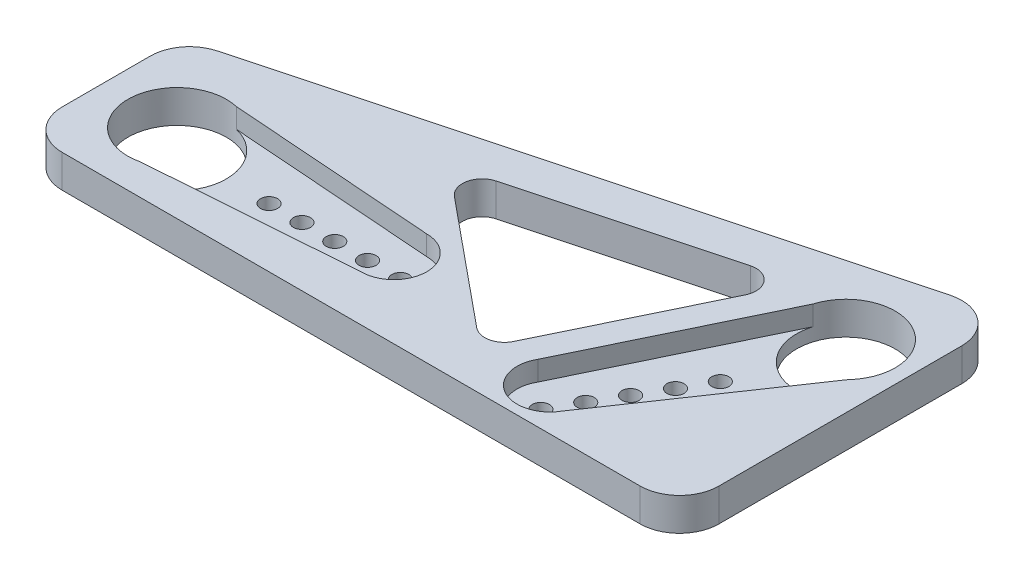
ISO-10303-21;
HEADER;
FILE_DESCRIPTION(('STEP AP214'),'2;1');
FILE_NAME('part.step','',(''),(''),'','','');
FILE_SCHEMA(('AUTOMOTIVE_DESIGN { 1 0 10303 214 1 1 1 1 }'));
ENDSEC;
DATA;
#1=APPLICATION_CONTEXT('core data for automotive mechanical design processes');
#2=APPLICATION_PROTOCOL_DEFINITION('international standard','automotive_design',2000,#1);
#3=PRODUCT_CONTEXT('',#1,'mechanical');
#4=PRODUCT('Part','Part','',(#3));
#5=PRODUCT_RELATED_PRODUCT_CATEGORY('part','',(#4));
#6=PRODUCT_DEFINITION_FORMATION('','',#4);
#7=PRODUCT_DEFINITION_CONTEXT('part definition',#1,'design');
#8=PRODUCT_DEFINITION('design','',#6,#7);
#9=PRODUCT_DEFINITION_SHAPE('','',#8);
#10=(LENGTH_UNIT() NAMED_UNIT(*) SI_UNIT(.MILLI.,.METRE.));
#11=(NAMED_UNIT(*) PLANE_ANGLE_UNIT() SI_UNIT($,.RADIAN.));
#12=(NAMED_UNIT(*) SI_UNIT($,.STERADIAN.) SOLID_ANGLE_UNIT());
#13=UNCERTAINTY_MEASURE_WITH_UNIT(LENGTH_MEASURE(1.E-05),#10,'distance_accuracy_value','');
#14=(GEOMETRIC_REPRESENTATION_CONTEXT(3) GLOBAL_UNCERTAINTY_ASSIGNED_CONTEXT((#13)) GLOBAL_UNIT_ASSIGNED_CONTEXT((#10,
#11,#12)) REPRESENTATION_CONTEXT('',''));
#15=CARTESIAN_POINT('',(0.,0.,0.));
#16=DIRECTION('',(0.,0.,1.));
#17=DIRECTION('',(1.,0.,0.));
#18=AXIS2_PLACEMENT_3D('',#15,#16,#17);
#19=CARTESIAN_POINT('',(37.916201182934,2.5,-4.94263164512558));
#20=DIRECTION('',(0.,-1.,0.));
#21=DIRECTION('',(0.,0.,-1.));
#22=AXIS2_PLACEMENT_3D('',#19,#20,#21);
#23=CYLINDRICAL_SURFACE('',#22,0.649999999999983);
#24=CARTESIAN_POINT('',(37.916201182934,0.,-4.94263164512558));
#25=DIRECTION('',(0.,1.,0.));
#26=DIRECTION('',(0.,0.,1.));
#27=AXIS2_PLACEMENT_3D('',#24,#25,#26);
#28=CIRCLE('',#27,0.649999999999983);
#29=CARTESIAN_POINT('',(37.916201182934,0.,-4.2926316451256));
#30=VERTEX_POINT('',#29);
#31=EDGE_CURVE('E336',#30,#30,#28,.T.);
#32=ORIENTED_EDGE('',*,*,#31,.F.);
#33=EDGE_LOOP('',(#32));
#34=FACE_BOUND('',#33,.T.);
#35=CARTESIAN_POINT('',(37.916201182934,1.,-4.94263164512558));
#36=DIRECTION('',(0.,1.,0.));
#37=DIRECTION('',(0.,0.,1.));
#38=AXIS2_PLACEMENT_3D('',#35,#36,#37);
#39=CIRCLE('',#38,0.649999999999983);
#40=CARTESIAN_POINT('',(37.916201182934,1.,-4.2926316451256));
#41=VERTEX_POINT('',#40);
#42=EDGE_CURVE('E242',#41,#41,#39,.F.);
#43=ORIENTED_EDGE('',*,*,#42,.F.);
#44=EDGE_LOOP('',(#43));
#45=FACE_BOUND('',#44,.T.);
#46=ADVANCED_FACE('F34',(#34,#45),#23,.F.);
#47=CARTESIAN_POINT('',(39.166201182934,2.5,-7.10769515458668));
#48=DIRECTION('',(0.,-1.,0.));
#49=DIRECTION('',(0.,0.,-1.));
#50=AXIS2_PLACEMENT_3D('',#47,#48,#49);
#51=CYLINDRICAL_SURFACE('',#50,0.649999999999983);
#52=CARTESIAN_POINT('',(39.166201182934,0.,-7.10769515458668));
#53=DIRECTION('',(0.,1.,0.));
#54=DIRECTION('',(0.,0.,1.));
#55=AXIS2_PLACEMENT_3D('',#52,#53,#54);
#56=CIRCLE('',#55,0.649999999999983);
#57=CARTESIAN_POINT('',(39.166201182934,0.,-6.4576951545867));
#58=VERTEX_POINT('',#57);
#59=EDGE_CURVE('E333',#58,#58,#56,.T.);
#60=ORIENTED_EDGE('',*,*,#59,.F.);
#61=EDGE_LOOP('',(#60));
#62=FACE_BOUND('',#61,.T.);
#63=CARTESIAN_POINT('',(39.166201182934,1.,-7.10769515458668));
#64=DIRECTION('',(0.,1.,0.));
#65=DIRECTION('',(0.,0.,1.));
#66=AXIS2_PLACEMENT_3D('',#63,#64,#65);
#67=CIRCLE('',#66,0.649999999999983);
#68=CARTESIAN_POINT('',(39.166201182934,1.,-6.4576951545867));
#69=VERTEX_POINT('',#68);
#70=EDGE_CURVE('E239',#69,#69,#67,.F.);
#71=ORIENTED_EDGE('',*,*,#70,.F.);
#72=EDGE_LOOP('',(#71));
#73=FACE_BOUND('',#72,.T.);
#74=ADVANCED_FACE('F458',(#62,#73),#51,.F.);
#75=CARTESIAN_POINT('',(40.416201182934,2.5,-9.27275866404778));
#76=DIRECTION('',(0.,-1.,0.));
#77=DIRECTION('',(0.,0.,-1.));
#78=AXIS2_PLACEMENT_3D('',#75,#76,#77);
#79=CYLINDRICAL_SURFACE('',#78,0.649999999999983);
#80=CARTESIAN_POINT('',(40.416201182934,0.,-9.27275866404778));
#81=DIRECTION('',(0.,1.,0.));
#82=DIRECTION('',(0.,0.,1.));
#83=AXIS2_PLACEMENT_3D('',#80,#81,#82);
#84=CIRCLE('',#83,0.649999999999983);
#85=CARTESIAN_POINT('',(40.416201182934,0.,-8.62275866404779));
#86=VERTEX_POINT('',#85);
#87=EDGE_CURVE('E330',#86,#86,#84,.T.);
#88=ORIENTED_EDGE('',*,*,#87,.F.);
#89=EDGE_LOOP('',(#88));
#90=FACE_BOUND('',#89,.T.);
#91=CARTESIAN_POINT('',(40.416201182934,1.,-9.27275866404778));
#92=DIRECTION('',(0.,1.,0.));
#93=DIRECTION('',(0.,0.,1.));
#94=AXIS2_PLACEMENT_3D('',#91,#92,#93);
#95=CIRCLE('',#94,0.649999999999983);
#96=CARTESIAN_POINT('',(40.416201182934,1.,-8.62275866404779));
#97=VERTEX_POINT('',#96);
#98=EDGE_CURVE('E235',#97,#97,#95,.F.);
#99=ORIENTED_EDGE('',*,*,#98,.F.);
#100=EDGE_LOOP('',(#99));
#101=FACE_BOUND('',#100,.T.);
#102=ADVANCED_FACE('F464',(#90,#101),#79,.F.);
#103=CARTESIAN_POINT('',(41.666201182934,2.5,-11.4378221735089));
#104=DIRECTION('',(0.,-1.,0.));
#105=DIRECTION('',(0.,0.,-1.));
#106=AXIS2_PLACEMENT_3D('',#103,#104,#105);
#107=CYLINDRICAL_SURFACE('',#106,0.649999999999983);
#108=CARTESIAN_POINT('',(41.666201182934,0.,-11.4378221735089));
#109=DIRECTION('',(0.,1.,0.));
#110=DIRECTION('',(0.,0.,1.));
#111=AXIS2_PLACEMENT_3D('',#108,#109,#110);
#112=CIRCLE('',#111,0.649999999999983);
#113=CARTESIAN_POINT('',(41.666201182934,0.,-10.7878221735089));
#114=VERTEX_POINT('',#113);
#115=EDGE_CURVE('E327',#114,#114,#112,.T.);
#116=ORIENTED_EDGE('',*,*,#115,.F.);
#117=EDGE_LOOP('',(#116));
#118=FACE_BOUND('',#117,.T.);
#119=CARTESIAN_POINT('',(41.666201182934,1.,-11.4378221735089));
#120=DIRECTION('',(0.,1.,0.));
#121=DIRECTION('',(0.,0.,1.));
#122=AXIS2_PLACEMENT_3D('',#119,#120,#121);
#123=CIRCLE('',#122,0.649999999999983);
#124=CARTESIAN_POINT('',(41.666201182934,1.,-10.7878221735089));
#125=VERTEX_POINT('',#124);
#126=EDGE_CURVE('E232',#125,#125,#123,.F.);
#127=ORIENTED_EDGE('',*,*,#126,.F.);
#128=EDGE_LOOP('',(#127));
#129=FACE_BOUND('',#128,.T.);
#130=ADVANCED_FACE('F475',(#118,#129),#107,.F.);
#131=CARTESIAN_POINT('',(22.75,2.5,-6.));
#132=DIRECTION('',(0.,-1.,0.));
#133=DIRECTION('',(0.,0.,-1.));
#134=AXIS2_PLACEMENT_3D('',#131,#132,#133);
#135=CYLINDRICAL_SURFACE('',#134,0.650000000000001);
#136=CARTESIAN_POINT('',(22.75,0.,-6.));
#137=DIRECTION('',(0.,1.,0.));
#138=DIRECTION('',(0.,0.,1.));
#139=AXIS2_PLACEMENT_3D('',#136,#137,#138);
#140=CIRCLE('',#139,0.650000000000001);
#141=CARTESIAN_POINT('',(22.75,0.,-5.35));
#142=VERTEX_POINT('',#141);
#143=EDGE_CURVE('E324',#142,#142,#140,.T.);
#144=ORIENTED_EDGE('',*,*,#143,.F.);
#145=EDGE_LOOP('',(#144));
#146=FACE_BOUND('',#145,.T.);
#147=CARTESIAN_POINT('',(22.75,1.,-6.));
#148=DIRECTION('',(0.,1.,0.));
#149=DIRECTION('',(0.,0.,1.));
#150=AXIS2_PLACEMENT_3D('',#147,#148,#149);
#151=CIRCLE('',#150,0.650000000000001);
#152=CARTESIAN_POINT('',(22.75,1.,-5.35));
#153=VERTEX_POINT('',#152);
#154=EDGE_CURVE('E433',#153,#153,#151,.F.);
#155=ORIENTED_EDGE('',*,*,#154,.F.);
#156=EDGE_LOOP('',(#155));
#157=FACE_BOUND('',#156,.T.);
#158=ADVANCED_FACE('F453',(#146,#157),#135,.F.);
#159=CARTESIAN_POINT('',(20.25,2.5,-6.));
#160=DIRECTION('',(0.,-1.,0.));
#161=DIRECTION('',(0.,0.,-1.));
#162=AXIS2_PLACEMENT_3D('',#159,#160,#161);
#163=CYLINDRICAL_SURFACE('',#162,0.650000000000001);
#164=CARTESIAN_POINT('',(20.25,0.,-6.));
#165=DIRECTION('',(0.,1.,0.));
#166=DIRECTION('',(0.,0.,1.));
#167=AXIS2_PLACEMENT_3D('',#164,#165,#166);
#168=CIRCLE('',#167,0.650000000000001);
#169=CARTESIAN_POINT('',(20.25,0.,-5.35));
#170=VERTEX_POINT('',#169);
#171=EDGE_CURVE('E321',#170,#170,#168,.T.);
#172=ORIENTED_EDGE('',*,*,#171,.F.);
#173=EDGE_LOOP('',(#172));
#174=FACE_BOUND('',#173,.T.);
#175=CARTESIAN_POINT('',(20.25,1.,-6.));
#176=DIRECTION('',(0.,1.,0.));
#177=DIRECTION('',(0.,0.,1.));
#178=AXIS2_PLACEMENT_3D('',#175,#176,#177);
#179=CIRCLE('',#178,0.650000000000001);
#180=CARTESIAN_POINT('',(20.25,1.,-5.35));
#181=VERTEX_POINT('',#180);
#182=EDGE_CURVE('E430',#181,#181,#179,.F.);
#183=ORIENTED_EDGE('',*,*,#182,.F.);
#184=EDGE_LOOP('',(#183));
#185=FACE_BOUND('',#184,.T.);
#186=ADVANCED_FACE('F443',(#174,#185),#163,.F.);
#187=CARTESIAN_POINT('',(17.75,2.5,-6.));
#188=DIRECTION('',(0.,-1.,0.));
#189=DIRECTION('',(0.,0.,-1.));
#190=AXIS2_PLACEMENT_3D('',#187,#188,#189);
#191=CYLINDRICAL_SURFACE('',#190,0.650000000000001);
#192=CARTESIAN_POINT('',(17.75,0.,-6.));
#193=DIRECTION('',(0.,1.,0.));
#194=DIRECTION('',(0.,0.,1.));
#195=AXIS2_PLACEMENT_3D('',#192,#193,#194);
#196=CIRCLE('',#195,0.650000000000001);
#197=CARTESIAN_POINT('',(17.75,0.,-5.35));
#198=VERTEX_POINT('',#197);
#199=EDGE_CURVE('E318',#198,#198,#196,.T.);
#200=ORIENTED_EDGE('',*,*,#199,.F.);
#201=EDGE_LOOP('',(#200));
#202=FACE_BOUND('',#201,.T.);
#203=CARTESIAN_POINT('',(17.75,1.,-6.));
#204=DIRECTION('',(0.,1.,0.));
#205=DIRECTION('',(0.,0.,1.));
#206=AXIS2_PLACEMENT_3D('',#203,#204,#205);
#207=CIRCLE('',#206,0.650000000000001);
#208=CARTESIAN_POINT('',(17.75,1.,-5.35));
#209=VERTEX_POINT('',#208);
#210=EDGE_CURVE('E211',#209,#209,#207,.F.);
#211=ORIENTED_EDGE('',*,*,#210,.F.);
#212=EDGE_LOOP('',(#211));
#213=FACE_BOUND('',#212,.T.);
#214=ADVANCED_FACE('F440',(#202,#213),#191,.F.);
#215=CARTESIAN_POINT('',(15.25,2.5,-6.));
#216=DIRECTION('',(0.,-1.,0.));
#217=DIRECTION('',(0.,0.,-1.));
#218=AXIS2_PLACEMENT_3D('',#215,#216,#217);
#219=CYLINDRICAL_SURFACE('',#218,0.650000000000001);
#220=CARTESIAN_POINT('',(15.25,0.,-6.));
#221=DIRECTION('',(0.,1.,0.));
#222=DIRECTION('',(0.,0.,1.));
#223=AXIS2_PLACEMENT_3D('',#220,#221,#222);
#224=CIRCLE('',#223,0.650000000000001);
#225=CARTESIAN_POINT('',(15.25,0.,-5.35));
#226=VERTEX_POINT('',#225);
#227=EDGE_CURVE('E315',#226,#226,#224,.T.);
#228=ORIENTED_EDGE('',*,*,#227,.F.);
#229=EDGE_LOOP('',(#228));
#230=FACE_BOUND('',#229,.T.);
#231=CARTESIAN_POINT('',(15.25,1.,-6.));
#232=DIRECTION('',(0.,1.,0.));
#233=DIRECTION('',(0.,0.,1.));
#234=AXIS2_PLACEMENT_3D('',#231,#232,#233);
#235=CIRCLE('',#234,0.650000000000001);
#236=CARTESIAN_POINT('',(15.25,1.,-5.35));
#237=VERTEX_POINT('',#236);
#238=EDGE_CURVE('E224',#237,#237,#235,.F.);
#239=ORIENTED_EDGE('',*,*,#238,.F.);
#240=EDGE_LOOP('',(#239));
#241=FACE_BOUND('',#240,.T.);
#242=ADVANCED_FACE('F442',(#230,#241),#219,.F.);
#243=CARTESIAN_POINT('',(12.75,2.5,-6.));
#244=DIRECTION('',(0.,-1.,0.));
#245=DIRECTION('',(0.,0.,-1.));
#246=AXIS2_PLACEMENT_3D('',#243,#244,#245);
#247=CYLINDRICAL_SURFACE('',#246,0.650000000000001);
#248=CARTESIAN_POINT('',(12.75,0.,-6.));
#249=DIRECTION('',(0.,1.,0.));
#250=DIRECTION('',(0.,0.,1.));
#251=AXIS2_PLACEMENT_3D('',#248,#249,#250);
#252=CIRCLE('',#251,0.650000000000001);
#253=CARTESIAN_POINT('',(12.75,0.,-5.35));
#254=VERTEX_POINT('',#253);
#255=EDGE_CURVE('E312',#254,#254,#252,.T.);
#256=ORIENTED_EDGE('',*,*,#255,.F.);
#257=EDGE_LOOP('',(#256));
#258=FACE_BOUND('',#257,.T.);
#259=CARTESIAN_POINT('',(12.75,1.,-6.));
#260=DIRECTION('',(0.,1.,0.));
#261=DIRECTION('',(0.,0.,1.));
#262=AXIS2_PLACEMENT_3D('',#259,#260,#261);
#263=CIRCLE('',#262,0.650000000000001);
#264=CARTESIAN_POINT('',(12.75,1.,-5.35));
#265=VERTEX_POINT('',#264);
#266=EDGE_CURVE('E208',#265,#265,#263,.F.);
#267=ORIENTED_EDGE('',*,*,#266,.F.);
#268=EDGE_LOOP('',(#267));
#269=FACE_BOUND('',#268,.T.);
#270=ADVANCED_FACE('F450',(#258,#269),#247,.F.);
#271=CARTESIAN_POINT('',(36.666201182934,2.5,-2.77756813566448));
#272=DIRECTION('',(0.,-1.,0.));
#273=DIRECTION('',(0.,0.,-1.));
#274=AXIS2_PLACEMENT_3D('',#271,#272,#273);
#275=CYLINDRICAL_SURFACE('',#274,0.649999999999975);
#276=CARTESIAN_POINT('',(36.666201182934,0.,-2.77756813566448));
#277=DIRECTION('',(0.,1.,0.));
#278=DIRECTION('',(0.,0.,1.));
#279=AXIS2_PLACEMENT_3D('',#276,#277,#278);
#280=CIRCLE('',#279,0.649999999999975);
#281=CARTESIAN_POINT('',(36.666201182934,0.,-2.12756813566451));
#282=VERTEX_POINT('',#281);
#283=EDGE_CURVE('E279',#282,#282,#280,.T.);
#284=ORIENTED_EDGE('',*,*,#283,.F.);
#285=EDGE_LOOP('',(#284));
#286=FACE_BOUND('',#285,.T.);
#287=CARTESIAN_POINT('',(36.666201182934,1.,-2.77756813566448));
#288=DIRECTION('',(0.,1.,0.));
#289=DIRECTION('',(0.,0.,1.));
#290=AXIS2_PLACEMENT_3D('',#287,#288,#289);
#291=CIRCLE('',#290,0.649999999999975);
#292=CARTESIAN_POINT('',(36.666201182934,1.,-2.12756813566451));
#293=VERTEX_POINT('',#292);
#294=EDGE_CURVE('E245',#293,#293,#291,.F.);
#295=ORIENTED_EDGE('',*,*,#294,.F.);
#296=EDGE_LOOP('',(#295));
#297=FACE_BOUND('',#296,.T.);
#298=ADVANCED_FACE('F470',(#286,#297),#275,.F.);
#299=CARTESIAN_POINT('',(50.,2.5,0.));
#300=DIRECTION('',(1.,0.,0.));
#301=DIRECTION('',(0.,0.,-1.));
#302=AXIS2_PLACEMENT_3D('',#299,#300,#301);
#303=PLANE('',#302);
#304=DIRECTION('',(0.,0.,1.));
#305=VECTOR('',#304,1.);
#306=CARTESIAN_POINT('',(50.,0.,0.));
#307=LINE('',#306,#305);
#308=CARTESIAN_POINT('',(50.,0.,-21.4877835030326));
#309=VERTEX_POINT('',#308);
#310=CARTESIAN_POINT('',(50.,0.,-3.));
#311=VERTEX_POINT('',#310);
#312=EDGE_CURVE('E300',#309,#311,#307,.T.);
#313=ORIENTED_EDGE('',*,*,#312,.F.);
#314=DIRECTION('',(0.,-1.,0.));
#315=VECTOR('',#314,1.);
#316=CARTESIAN_POINT('',(50.,2.5,-21.4877835030326));
#317=LINE('',#316,#315);
#318=CARTESIAN_POINT('',(50.,2.5,-21.4877835030326));
#319=VERTEX_POINT('',#318);
#320=EDGE_CURVE('E374',#309,#319,#317,.F.);
#321=ORIENTED_EDGE('',*,*,#320,.T.);
#322=DIRECTION('',(0.,0.,1.));
#323=VECTOR('',#322,1.);
#324=CARTESIAN_POINT('',(50.,2.5,0.));
#325=LINE('',#324,#323);
#326=CARTESIAN_POINT('',(50.,2.5,-3.));
#327=VERTEX_POINT('',#326);
#328=EDGE_CURVE('E282',#319,#327,#325,.T.);
#329=ORIENTED_EDGE('',*,*,#328,.T.);
#330=DIRECTION('',(0.,-1.,0.));
#331=VECTOR('',#330,1.);
#332=CARTESIAN_POINT('',(50.,0.,-3.));
#333=LINE('',#332,#331);
#334=EDGE_CURVE('E371',#327,#311,#333,.T.);
#335=ORIENTED_EDGE('',*,*,#334,.T.);
#336=EDGE_LOOP('',(#313,#321,#329,#335));
#337=FACE_BOUND('',#336,.T.);
#338=ADVANCED_FACE('F574',(#337),#303,.T.);
#339=CARTESIAN_POINT('',(-3.00000000000001,2.5,-11.1961524227066));
#340=DIRECTION('',(-0.258819045102522,0.,-0.965925826289068));
#341=DIRECTION('',(-0.965925826289068,0.,0.258819045102522));
#342=AXIS2_PLACEMENT_3D('',#339,#340,#341);
#343=PLANE('',#342);
#344=DIRECTION('',(0.965925826289068,0.,-0.258819045102522));
#345=VECTOR('',#344,1.);
#346=CARTESIAN_POINT('',(-3.00000000000001,0.,-11.1961524227066));
#347=LINE('',#346,#345);
#348=CARTESIAN_POINT('',(2.22354286469244,0.,-12.5957965149303));
#349=VERTEX_POINT('',#348);
#350=CARTESIAN_POINT('',(46.2235428646924,0.,-24.3855609818998));
#351=VERTEX_POINT('',#350);
#352=EDGE_CURVE('E303',#349,#351,#347,.T.);
#353=ORIENTED_EDGE('',*,*,#352,.F.);
#354=DIRECTION('',(0.,-1.,0.));
#355=VECTOR('',#354,1.);
#356=CARTESIAN_POINT('',(2.22354286469244,2.5,-12.5957965149303));
#357=LINE('',#356,#355);
#358=CARTESIAN_POINT('',(2.22354286469244,2.5,-12.5957965149303));
#359=VERTEX_POINT('',#358);
#360=EDGE_CURVE('E369',#349,#359,#357,.F.);
#361=ORIENTED_EDGE('',*,*,#360,.T.);
#362=DIRECTION('',(0.965925826289068,0.,-0.258819045102522));
#363=VECTOR('',#362,1.);
#364=CARTESIAN_POINT('',(-3.00000000000001,2.5,-11.1961524227066));
#365=LINE('',#364,#363);
#366=CARTESIAN_POINT('',(46.2235428646924,2.5,-24.3855609818998));
#367=VERTEX_POINT('',#366);
#368=EDGE_CURVE('E285',#359,#367,#365,.T.);
#369=ORIENTED_EDGE('',*,*,#368,.T.);
#370=DIRECTION('',(0.,-1.,0.));
#371=VECTOR('',#370,1.);
#372=CARTESIAN_POINT('',(46.2235428646924,2.5,-24.3855609818998));
#373=LINE('',#372,#371);
#374=EDGE_CURVE('E366',#367,#351,#373,.T.);
#375=ORIENTED_EDGE('',*,*,#374,.T.);
#376=EDGE_LOOP('',(#353,#361,#369,#375));
#377=FACE_BOUND('',#376,.T.);
#378=ADVANCED_FACE('F579',(#377),#343,.T.);
#379=CARTESIAN_POINT('',(0.,2.5,0.));
#380=DIRECTION('',(-1.,0.,0.));
#381=DIRECTION('',(0.,0.,1.));
#382=AXIS2_PLACEMENT_3D('',#379,#380,#381);
#383=PLANE('',#382);
#384=DIRECTION('',(0.,0.,-1.));
#385=VECTOR('',#384,1.);
#386=CARTESIAN_POINT('',(0.,0.,0.));
#387=LINE('',#386,#385);
#388=CARTESIAN_POINT('',(0.,0.,-3.));
#389=VERTEX_POINT('',#388);
#390=CARTESIAN_POINT('',(0.,0.,-9.69801903606312));
#391=VERTEX_POINT('',#390);
#392=EDGE_CURVE('E306',#389,#391,#387,.T.);
#393=ORIENTED_EDGE('',*,*,#392,.F.);
#394=DIRECTION('',(0.,-1.,0.));
#395=VECTOR('',#394,1.);
#396=CARTESIAN_POINT('',(0.,2.5,-3.));
#397=LINE('',#396,#395);
#398=CARTESIAN_POINT('',(0.,2.5,-3.));
#399=VERTEX_POINT('',#398);
#400=EDGE_CURVE('E356',#389,#399,#397,.F.);
#401=ORIENTED_EDGE('',*,*,#400,.T.);
#402=DIRECTION('',(0.,0.,-1.));
#403=VECTOR('',#402,1.);
#404=CARTESIAN_POINT('',(0.,2.5,0.));
#405=LINE('',#404,#403);
#406=CARTESIAN_POINT('',(0.,2.5,-9.69801903606312));
#407=VERTEX_POINT('',#406);
#408=EDGE_CURVE('E288',#399,#407,#405,.T.);
#409=ORIENTED_EDGE('',*,*,#408,.T.);
#410=DIRECTION('',(0.,-1.,0.));
#411=VECTOR('',#410,1.);
#412=CARTESIAN_POINT('',(0.,2.5,-9.69801903606312));
#413=LINE('',#412,#411);
#414=EDGE_CURVE('E353',#407,#391,#413,.T.);
#415=ORIENTED_EDGE('',*,*,#414,.T.);
#416=EDGE_LOOP('',(#393,#401,#409,#415));
#417=FACE_BOUND('',#416,.T.);
#418=ADVANCED_FACE('F590',(#417),#383,.T.);
#419=CARTESIAN_POINT('',(0.,2.5,0.));
#420=DIRECTION('',(0.,0.,-1.));
#421=DIRECTION('',(-1.,0.,0.));
#422=AXIS2_PLACEMENT_3D('',#419,#420,#421);
#423=PLANE('',#422);
#424=DIRECTION('',(1.,0.,0.));
#425=VECTOR('',#424,1.);
#426=CARTESIAN_POINT('',(0.,2.5,0.));
#427=LINE('',#426,#425);
#428=CARTESIAN_POINT('',(3.,2.5,0.));
#429=VERTEX_POINT('',#428);
#430=CARTESIAN_POINT('',(47.,2.5,0.));
#431=VERTEX_POINT('',#430);
#432=EDGE_CURVE('E291',#429,#431,#427,.T.);
#433=ORIENTED_EDGE('',*,*,#432,.F.);
#434=DIRECTION('',(0.,-1.,0.));
#435=VECTOR('',#434,1.);
#436=CARTESIAN_POINT('',(3.,0.,0.));
#437=LINE('',#436,#435);
#438=CARTESIAN_POINT('',(3.,0.,0.));
#439=VERTEX_POINT('',#438);
#440=EDGE_CURVE('E342',#429,#439,#437,.T.);
#441=ORIENTED_EDGE('',*,*,#440,.T.);
#442=DIRECTION('',(1.,0.,0.));
#443=VECTOR('',#442,1.);
#444=CARTESIAN_POINT('',(0.,0.,0.));
#445=LINE('',#444,#443);
#446=CARTESIAN_POINT('',(47.,0.,0.));
#447=VERTEX_POINT('',#446);
#448=EDGE_CURVE('E309',#439,#447,#445,.T.);
#449=ORIENTED_EDGE('',*,*,#448,.T.);
#450=DIRECTION('',(0.,-1.,0.));
#451=VECTOR('',#450,1.);
#452=CARTESIAN_POINT('',(47.,2.5,0.));
#453=LINE('',#452,#451);
#454=EDGE_CURVE('E294',#447,#431,#453,.F.);
#455=ORIENTED_EDGE('',*,*,#454,.T.);
#456=EDGE_LOOP('',(#433,#441,#449,#455));
#457=FACE_BOUND('',#456,.T.);
#458=ADVANCED_FACE('F600',(#457),#423,.F.);
#459=CARTESIAN_POINT('',(5.75,2.5,-6.));
#460=DIRECTION('',(0.,-1.,0.));
#461=DIRECTION('',(0.,0.,-1.));
#462=AXIS2_PLACEMENT_3D('',#459,#460,#461);
#463=CYLINDRICAL_SURFACE('',#462,3.75);
#464=DIRECTION('',(0.,1.,0.));
#465=VECTOR('',#464,1.);
#466=CARTESIAN_POINT('',(6.61023252670425,1.,-2.35));
#467=LINE('',#466,#465);
#468=CARTESIAN_POINT('',(6.61023252670425,1.,-2.35));
#469=VERTEX_POINT('',#468);
#470=CARTESIAN_POINT('',(6.61023252670425,2.5,-2.35));
#471=VERTEX_POINT('',#470);
#472=EDGE_CURVE('E225',#469,#471,#467,.T.);
#473=ORIENTED_EDGE('',*,*,#472,.F.);
#474=CARTESIAN_POINT('',(5.75,1.,-6.));
#475=DIRECTION('',(0.,1.,0.));
#476=DIRECTION('',(0.,0.,1.));
#477=AXIS2_PLACEMENT_3D('',#474,#475,#476);
#478=CIRCLE('',#477,3.75);
#479=CARTESIAN_POINT('',(6.61023252670424,1.,-9.65));
#480=VERTEX_POINT('',#479);
#481=EDGE_CURVE('E195',#480,#469,#478,.F.);
#482=ORIENTED_EDGE('',*,*,#481,.F.);
#483=DIRECTION('',(0.,1.,0.));
#484=VECTOR('',#483,1.);
#485=CARTESIAN_POINT('',(6.61023252670424,1.,-9.65));
#486=LINE('',#485,#484);
#487=CARTESIAN_POINT('',(6.61023252670424,2.5,-9.65));
#488=VERTEX_POINT('',#487);
#489=EDGE_CURVE('E228',#480,#488,#486,.T.);
#490=ORIENTED_EDGE('',*,*,#489,.T.);
#491=CARTESIAN_POINT('',(5.75,2.5,-6.));
#492=DIRECTION('',(0.,1.,0.));
#493=DIRECTION('',(0.,0.,1.));
#494=AXIS2_PLACEMENT_3D('',#491,#492,#493);
#495=CIRCLE('',#494,3.75);
#496=EDGE_CURVE('E278',#488,#471,#495,.T.);
#497=ORIENTED_EDGE('',*,*,#496,.T.);
#498=EDGE_LOOP('',(#473,#482,#490,#497));
#499=FACE_BOUND('',#498,.T.);
#500=CARTESIAN_POINT('',(5.75,0.,-6.));
#501=DIRECTION('',(0.,1.,0.));
#502=DIRECTION('',(0.,0.,1.));
#503=AXIS2_PLACEMENT_3D('',#500,#501,#502);
#504=CIRCLE('',#503,3.75);
#505=CARTESIAN_POINT('',(5.75,0.,-2.25));
#506=VERTEX_POINT('',#505);
#507=EDGE_CURVE('E297',#506,#506,#504,.T.);
#508=ORIENTED_EDGE('',*,*,#507,.F.);
#509=EDGE_LOOP('',(#508));
#510=FACE_BOUND('',#509,.T.);
#511=ADVANCED_FACE('F610',(#499,#510),#463,.F.);
#512=CARTESIAN_POINT('',(45.166201182934,2.5,-17.5));
#513=DIRECTION('',(0.,-1.,0.));
#514=DIRECTION('',(0.,0.,-1.));
#515=AXIS2_PLACEMENT_3D('',#512,#513,#514);
#516=CYLINDRICAL_SURFACE('',#515,3.75000000000001);
#517=DIRECTION('',(0.,1.,0.));
#518=VECTOR('',#517,1.);
#519=CARTESIAN_POINT('',(47.8970776433951,1.,-14.9300167787124));
#520=LINE('',#519,#518);
#521=CARTESIAN_POINT('',(47.8970776433951,1.,-14.9300167787124));
#522=VERTEX_POINT('',#521);
#523=CARTESIAN_POINT('',(47.8970776433951,2.5,-14.9300167787124));
#524=VERTEX_POINT('',#523);
#525=EDGE_CURVE('E219',#522,#524,#520,.T.);
#526=ORIENTED_EDGE('',*,*,#525,.T.);
#527=CARTESIAN_POINT('',(45.166201182934,2.5,-17.5));
#528=DIRECTION('',(0.,1.,0.));
#529=DIRECTION('',(0.,0.,1.));
#530=AXIS2_PLACEMENT_3D('',#527,#528,#529);
#531=CIRCLE('',#530,3.75000000000001);
#532=CARTESIAN_POINT('',(41.5750921957686,2.5,-18.5800167787124));
#533=VERTEX_POINT('',#532);
#534=EDGE_CURVE('E275',#524,#533,#531,.T.);
#535=ORIENTED_EDGE('',*,*,#534,.T.);
#536=DIRECTION('',(0.,1.,0.));
#537=VECTOR('',#536,1.);
#538=CARTESIAN_POINT('',(41.5750921957686,1.,-18.5800167787124));
#539=LINE('',#538,#537);
#540=CARTESIAN_POINT('',(41.5750921957686,1.,-18.5800167787124));
#541=VERTEX_POINT('',#540);
#542=EDGE_CURVE('E259',#541,#533,#539,.T.);
#543=ORIENTED_EDGE('',*,*,#542,.F.);
#544=CARTESIAN_POINT('',(45.166201182934,1.,-17.5));
#545=DIRECTION('',(0.,1.,0.));
#546=DIRECTION('',(0.,0.,1.));
#547=AXIS2_PLACEMENT_3D('',#544,#545,#546);
#548=CIRCLE('',#547,3.75000000000001);
#549=EDGE_CURVE('E248',#522,#541,#548,.F.);
#550=ORIENTED_EDGE('',*,*,#549,.F.);
#551=EDGE_LOOP('',(#526,#535,#543,#550));
#552=FACE_BOUND('',#551,.T.);
#553=CARTESIAN_POINT('',(45.166201182934,0.,-17.5));
#554=DIRECTION('',(0.,1.,0.));
#555=DIRECTION('',(0.,0.,1.));
#556=AXIS2_PLACEMENT_3D('',#553,#554,#555);
#557=CIRCLE('',#556,3.75000000000001);
#558=CARTESIAN_POINT('',(45.166201182934,0.,-13.75));
#559=VERTEX_POINT('',#558);
#560=EDGE_CURVE('E227',#559,#559,#557,.T.);
#561=ORIENTED_EDGE('',*,*,#560,.F.);
#562=EDGE_LOOP('',(#561));
#563=FACE_BOUND('',#562,.T.);
#564=ADVANCED_FACE('F527',(#552,#563),#516,.F.);
#565=CARTESIAN_POINT('',(0.,2.5,0.));
#566=DIRECTION('',(0.,1.,0.));
#567=DIRECTION('',(0.,0.,1.));
#568=AXIS2_PLACEMENT_3D('',#565,#566,#567);
#569=PLANE('',#568);
#570=DIRECTION('',(0.772896236920538,0.,0.634532431759064));
#571=VECTOR('',#570,1.);
#572=CARTESIAN_POINT('',(31.8239018815725,2.5,-3.));
#573=LINE('',#572,#571);
#574=CARTESIAN_POINT('',(20.8368383712595,2.5,-12.0201605261625));
#575=VERTEX_POINT('',#574);
#576=CARTESIAN_POINT('',(30.3508831143184,2.5,-4.20931909842973));
#577=VERTEX_POINT('',#576);
#578=EDGE_CURVE('E403',#575,#577,#573,.T.);
#579=ORIENTED_EDGE('',*,*,#578,.F.);
#580=CARTESIAN_POINT('',(21.7886370188981,2.5,-13.1795048815433));
#581=DIRECTION('',(0.,1.,0.));
#582=DIRECTION('',(0.,0.,1.));
#583=AXIS2_PLACEMENT_3D('',#580,#581,#582);
#584=CIRCLE('',#583,1.5);
#585=CARTESIAN_POINT('',(21.4004084512444,2.5,-14.6283936209769));
#586=VERTEX_POINT('',#585);
#587=EDGE_CURVE('E42',#575,#586,#584,.F.);
#588=ORIENTED_EDGE('',*,*,#587,.T.);
#589=DIRECTION('',(-0.965925826289068,0.,0.258819045102521));
#590=VECTOR('',#589,1.);
#591=CARTESIAN_POINT('',(18.5802869508985,2.5,-13.8727443424015));
#592=LINE('',#591,#590);
#593=CARTESIAN_POINT('',(36.6664030240039,2.5,-18.7189045384057));
#594=VERTEX_POINT('',#593);
#595=EDGE_CURVE('E401',#594,#586,#592,.T.);
#596=ORIENTED_EDGE('',*,*,#595,.F.);
#597=CARTESIAN_POINT('',(37.0546315916577,2.5,-17.2700157989721));
#598=DIRECTION('',(0.,1.,0.));
#599=DIRECTION('',(0.,0.,1.));
#600=AXIS2_PLACEMENT_3D('',#597,#598,#599);
#601=CIRCLE('',#600,1.5);
#602=CARTESIAN_POINT('',(38.4051714919912,2.5,-16.6172968873363));
#603=VERTEX_POINT('',#602);
#604=EDGE_CURVE('E394',#594,#603,#601,.F.);
#605=ORIENTED_EDGE('',*,*,#604,.T.);
#606=DIRECTION('',(0.435145941090512,0.,-0.900359933555716));
#607=VECTOR('',#606,1.);
#608=CARTESIAN_POINT('',(39.830655129258,2.5,-19.566763334657));
#609=LINE('',#608,#607);
#610=CARTESIAN_POINT('',(32.6532216622906,2.5,-4.71594454217478));
#611=VERTEX_POINT('',#610);
#612=EDGE_CURVE('E409',#611,#603,#609,.T.);
#613=ORIENTED_EDGE('',*,*,#612,.F.);
#614=CARTESIAN_POINT('',(31.302681761957,2.5,-5.36866345381055));
#615=DIRECTION('',(0.,1.,0.));
#616=DIRECTION('',(0.,0.,1.));
#617=AXIS2_PLACEMENT_3D('',#614,#615,#616);
#618=CIRCLE('',#617,1.5);
#619=EDGE_CURVE('E390',#611,#577,#618,.F.);
#620=ORIENTED_EDGE('',*,*,#619,.T.);
#621=EDGE_LOOP('',(#579,#588,#596,#605,#613,#620));
#622=FACE_BOUND('',#621,.T.);
#623=DIRECTION('',(0.997307545554175,0.,-0.0733325274397841));
#624=VECTOR('',#623,1.);
#625=CARTESIAN_POINT('',(-0.13631986465517,2.5,-1.85392259582435));
#626=LINE('',#625,#624);
#627=CARTESIAN_POINT('',(22.25,2.5,-3.5));
#628=VERTEX_POINT('',#627);
#629=EDGE_CURVE('E190',#471,#628,#626,.T.);
#630=ORIENTED_EDGE('',*,*,#629,.F.);
#631=ORIENTED_EDGE('',*,*,#496,.F.);
#632=DIRECTION('',(0.997307545554175,0.,0.0733325274397841));
#633=VECTOR('',#632,1.);
#634=CARTESIAN_POINT('',(0.741301130747893,2.5,-10.0815454892072));
#635=LINE('',#634,#633);
#636=CARTESIAN_POINT('',(22.25,2.5,-8.5));
#637=VERTEX_POINT('',#636);
#638=EDGE_CURVE('E221',#488,#637,#635,.T.);
#639=ORIENTED_EDGE('',*,*,#638,.T.);
#640=CARTESIAN_POINT('',(22.25,2.5,-6.));
#641=DIRECTION('',(0.,1.,0.));
#642=DIRECTION('',(0.,0.,1.));
#643=AXIS2_PLACEMENT_3D('',#640,#641,#642);
#644=CIRCLE('',#643,2.5);
#645=EDGE_CURVE('E218',#628,#637,#644,.T.);
#646=ORIENTED_EDGE('',*,*,#645,.F.);
#647=EDGE_LOOP('',(#630,#631,#639,#646));
#648=FACE_BOUND('',#647,.T.);
#649=DIRECTION('',(0.562161604463658,0.,-0.827027406115932));
#650=VECTOR('',#649,1.);
#651=CARTESIAN_POINT('',(25.8190626220352,2.5,17.5501870458164));
#652=LINE('',#651,#650);
#653=CARTESIAN_POINT('',(39.0812646923951,2.5,-1.96058083755671));
#654=VERTEX_POINT('',#653);
#655=EDGE_CURVE('E236',#654,#524,#652,.T.);
#656=ORIENTED_EDGE('',*,*,#655,.F.);
#657=CARTESIAN_POINT('',(36.916201182934,2.5,-3.2105808375567));
#658=DIRECTION('',(0.,1.,0.));
#659=DIRECTION('',(0.,0.,1.));
#660=AXIS2_PLACEMENT_3D('',#657,#658,#659);
#661=CIRCLE('',#660,2.5);
#662=CARTESIAN_POINT('',(34.7511376734729,2.5,-4.46058083755669));
#663=VERTEX_POINT('',#662);
#664=EDGE_CURVE('E263',#663,#654,#661,.T.);
#665=ORIENTED_EDGE('',*,*,#664,.F.);
#666=DIRECTION('',(0.435145941090513,0.,-0.900359933555715));
#667=VECTOR('',#666,1.);
#668=CARTESIAN_POINT('',(26.4233386845084,2.5,12.7704578470253));
#669=LINE('',#668,#667);
#670=EDGE_CURVE('E260',#663,#533,#669,.T.);
#671=ORIENTED_EDGE('',*,*,#670,.T.);
#672=ORIENTED_EDGE('',*,*,#534,.F.);
#673=EDGE_LOOP('',(#656,#665,#671,#672));
#674=FACE_BOUND('',#673,.T.);
#675=ORIENTED_EDGE('',*,*,#408,.F.);
#676=CARTESIAN_POINT('',(3.,2.5,-3.));
#677=DIRECTION('',(0.,1.,0.));
#678=DIRECTION('',(0.,0.,1.));
#679=AXIS2_PLACEMENT_3D('',#676,#677,#678);
#680=CIRCLE('',#679,3.);
#681=EDGE_CURVE('E364',#399,#429,#680,.T.);
#682=ORIENTED_EDGE('',*,*,#681,.T.);
#683=ORIENTED_EDGE('',*,*,#432,.T.);
#684=CARTESIAN_POINT('',(47.,2.5,-3.));
#685=DIRECTION('',(0.,1.,0.));
#686=DIRECTION('',(0.,0.,1.));
#687=AXIS2_PLACEMENT_3D('',#684,#685,#686);
#688=CIRCLE('',#687,3.);
#689=EDGE_CURVE('E358',#431,#327,#688,.T.);
#690=ORIENTED_EDGE('',*,*,#689,.T.);
#691=ORIENTED_EDGE('',*,*,#328,.F.);
#692=CARTESIAN_POINT('',(47.,2.5,-21.4877835030326));
#693=DIRECTION('',(0.,1.,0.));
#694=DIRECTION('',(0.,0.,1.));
#695=AXIS2_PLACEMENT_3D('',#692,#693,#694);
#696=CIRCLE('',#695,3.);
#697=EDGE_CURVE('E360',#319,#367,#696,.T.);
#698=ORIENTED_EDGE('',*,*,#697,.T.);
#699=ORIENTED_EDGE('',*,*,#368,.F.);
#700=CARTESIAN_POINT('',(3.,2.5,-9.69801903606312));
#701=DIRECTION('',(0.,1.,0.));
#702=DIRECTION('',(0.,0.,1.));
#703=AXIS2_PLACEMENT_3D('',#700,#701,#702);
#704=CIRCLE('',#703,3.);
#705=EDGE_CURVE('E362',#359,#407,#704,.T.);
#706=ORIENTED_EDGE('',*,*,#705,.T.);
#707=EDGE_LOOP('',(#675,#682,#683,#690,#691,#698,#699,#706));
#708=FACE_BOUND('',#707,.T.);
#709=ADVANCED_FACE('F399',(#622,#648,#674,#708),#569,.T.);
#710=CARTESIAN_POINT('',(0.,0.,0.));
#711=DIRECTION('',(0.,1.,0.));
#712=DIRECTION('',(0.,0.,1.));
#713=AXIS2_PLACEMENT_3D('',#710,#711,#712);
#714=PLANE('',#713);
#715=DIRECTION('',(0.435145941090512,0.,-0.900359933555716));
#716=VECTOR('',#715,1.);
#717=CARTESIAN_POINT('',(39.830655129258,0.,-19.566763334657));
#718=LINE('',#717,#716);
#719=CARTESIAN_POINT('',(32.6532216622906,0.,-4.71594454217478));
#720=VERTEX_POINT('',#719);
#721=CARTESIAN_POINT('',(38.4051714919912,0.,-16.6172968873363));
#722=VERTEX_POINT('',#721);
#723=EDGE_CURVE('E420',#720,#722,#718,.T.);
#724=ORIENTED_EDGE('',*,*,#723,.T.);
#725=CARTESIAN_POINT('',(37.0546315916577,0.,-17.2700157989721));
#726=DIRECTION('',(0.,1.,0.));
#727=DIRECTION('',(0.,0.,1.));
#728=AXIS2_PLACEMENT_3D('',#725,#726,#727);
#729=CIRCLE('',#728,1.5);
#730=CARTESIAN_POINT('',(36.6664030240039,0.,-18.7189045384057));
#731=VERTEX_POINT('',#730);
#732=EDGE_CURVE('E56',#722,#731,#729,.T.);
#733=ORIENTED_EDGE('',*,*,#732,.T.);
#734=DIRECTION('',(-0.965925826289068,0.,0.258819045102521));
#735=VECTOR('',#734,1.);
#736=CARTESIAN_POINT('',(18.5802869508985,0.,-13.8727443424015));
#737=LINE('',#736,#735);
#738=CARTESIAN_POINT('',(21.4004084512444,0.,-14.6283936209769));
#739=VERTEX_POINT('',#738);
#740=EDGE_CURVE('E264',#731,#739,#737,.T.);
#741=ORIENTED_EDGE('',*,*,#740,.T.);
#742=CARTESIAN_POINT('',(21.7886370188981,0.,-13.1795048815433));
#743=DIRECTION('',(0.,1.,0.));
#744=DIRECTION('',(0.,0.,1.));
#745=AXIS2_PLACEMENT_3D('',#742,#743,#744);
#746=CIRCLE('',#745,1.5);
#747=CARTESIAN_POINT('',(20.8368383712595,0.,-12.0201605261625));
#748=VERTEX_POINT('',#747);
#749=EDGE_CURVE('E11',#739,#748,#746,.T.);
#750=ORIENTED_EDGE('',*,*,#749,.T.);
#751=DIRECTION('',(0.772896236920538,0.,0.634532431759064));
#752=VECTOR('',#751,1.);
#753=CARTESIAN_POINT('',(31.8239018815725,0.,-3.));
#754=LINE('',#753,#752);
#755=CARTESIAN_POINT('',(30.3508831143184,0.,-4.20931909842973));
#756=VERTEX_POINT('',#755);
#757=EDGE_CURVE('E408',#748,#756,#754,.T.);
#758=ORIENTED_EDGE('',*,*,#757,.T.);
#759=CARTESIAN_POINT('',(31.302681761957,0.,-5.36866345381055));
#760=DIRECTION('',(0.,1.,0.));
#761=DIRECTION('',(0.,0.,1.));
#762=AXIS2_PLACEMENT_3D('',#759,#760,#761);
#763=CIRCLE('',#762,1.5);
#764=EDGE_CURVE('E392',#756,#720,#763,.T.);
#765=ORIENTED_EDGE('',*,*,#764,.T.);
#766=EDGE_LOOP('',(#724,#733,#741,#750,#758,#765));
#767=FACE_BOUND('',#766,.T.);
#768=ORIENTED_EDGE('',*,*,#560,.T.);
#769=EDGE_LOOP('',(#768));
#770=FACE_BOUND('',#769,.T.);
#771=ORIENTED_EDGE('',*,*,#507,.T.);
#772=EDGE_LOOP('',(#771));
#773=FACE_BOUND('',#772,.T.);
#774=ORIENTED_EDGE('',*,*,#448,.F.);
#775=CARTESIAN_POINT('',(3.,0.,-3.));
#776=DIRECTION('',(0.,1.,0.));
#777=DIRECTION('',(0.,0.,1.));
#778=AXIS2_PLACEMENT_3D('',#775,#776,#777);
#779=CIRCLE('',#778,3.);
#780=EDGE_CURVE('E351',#439,#389,#779,.F.);
#781=ORIENTED_EDGE('',*,*,#780,.T.);
#782=ORIENTED_EDGE('',*,*,#392,.T.);
#783=CARTESIAN_POINT('',(3.,0.,-9.69801903606312));
#784=DIRECTION('',(0.,1.,0.));
#785=DIRECTION('',(0.,0.,1.));
#786=AXIS2_PLACEMENT_3D('',#783,#784,#785);
#787=CIRCLE('',#786,3.);
#788=EDGE_CURVE('E349',#391,#349,#787,.F.);
#789=ORIENTED_EDGE('',*,*,#788,.T.);
#790=ORIENTED_EDGE('',*,*,#352,.T.);
#791=CARTESIAN_POINT('',(47.,0.,-21.4877835030326));
#792=DIRECTION('',(0.,1.,0.));
#793=DIRECTION('',(0.,0.,1.));
#794=AXIS2_PLACEMENT_3D('',#791,#792,#793);
#795=CIRCLE('',#794,3.);
#796=EDGE_CURVE('E347',#351,#309,#795,.F.);
#797=ORIENTED_EDGE('',*,*,#796,.T.);
#798=ORIENTED_EDGE('',*,*,#312,.T.);
#799=CARTESIAN_POINT('',(47.,0.,-3.));
#800=DIRECTION('',(0.,1.,0.));
#801=DIRECTION('',(0.,0.,1.));
#802=AXIS2_PLACEMENT_3D('',#799,#800,#801);
#803=CIRCLE('',#802,3.);
#804=EDGE_CURVE('E345',#311,#447,#803,.F.);
#805=ORIENTED_EDGE('',*,*,#804,.T.);
#806=EDGE_LOOP('',(#774,#781,#782,#789,#790,#797,#798,#805));
#807=FACE_BOUND('',#806,.T.);
#808=ORIENTED_EDGE('',*,*,#255,.T.);
#809=EDGE_LOOP('',(#808));
#810=FACE_BOUND('',#809,.T.);
#811=ORIENTED_EDGE('',*,*,#227,.T.);
#812=EDGE_LOOP('',(#811));
#813=FACE_BOUND('',#812,.T.);
#814=ORIENTED_EDGE('',*,*,#199,.T.);
#815=EDGE_LOOP('',(#814));
#816=FACE_BOUND('',#815,.T.);
#817=ORIENTED_EDGE('',*,*,#171,.T.);
#818=EDGE_LOOP('',(#817));
#819=FACE_BOUND('',#818,.T.);
#820=ORIENTED_EDGE('',*,*,#143,.T.);
#821=EDGE_LOOP('',(#820));
#822=FACE_BOUND('',#821,.T.);
#823=ORIENTED_EDGE('',*,*,#115,.T.);
#824=EDGE_LOOP('',(#823));
#825=FACE_BOUND('',#824,.T.);
#826=ORIENTED_EDGE('',*,*,#87,.T.);
#827=EDGE_LOOP('',(#826));
#828=FACE_BOUND('',#827,.T.);
#829=ORIENTED_EDGE('',*,*,#59,.T.);
#830=EDGE_LOOP('',(#829));
#831=FACE_BOUND('',#830,.T.);
#832=ORIENTED_EDGE('',*,*,#31,.T.);
#833=EDGE_LOOP('',(#832));
#834=FACE_BOUND('',#833,.T.);
#835=ORIENTED_EDGE('',*,*,#283,.T.);
#836=EDGE_LOOP('',(#835));
#837=FACE_BOUND('',#836,.T.);
#838=ADVANCED_FACE('F414',(#767,#770,#773,#807,#810,#813,#816,#819,#822,#825,#828,#831,#834,
#837),#714,.F.);
#839=CARTESIAN_POINT('',(25.8190626220352,1.,17.5501870458164));
#840=DIRECTION('',(0.827027406115932,0.,0.562161604463658));
#841=DIRECTION('',(0.562161604463658,0.,-0.827027406115932));
#842=AXIS2_PLACEMENT_3D('',#839,#840,#841);
#843=PLANE('',#842);
#844=ORIENTED_EDGE('',*,*,#655,.T.);
#845=ORIENTED_EDGE('',*,*,#525,.F.);
#846=DIRECTION('',(0.562161604463658,0.,-0.827027406115932));
#847=VECTOR('',#846,1.);
#848=CARTESIAN_POINT('',(25.8190626220352,1.,17.5501870458164));
#849=LINE('',#848,#847);
#850=CARTESIAN_POINT('',(39.0812646923951,1.,-1.96058083755671));
#851=VERTEX_POINT('',#850);
#852=EDGE_CURVE('E256',#851,#522,#849,.T.);
#853=ORIENTED_EDGE('',*,*,#852,.F.);
#854=DIRECTION('',(0.,1.,0.));
#855=VECTOR('',#854,1.);
#856=CARTESIAN_POINT('',(39.0812646923951,1.,-1.96058083755671));
#857=LINE('',#856,#855);
#858=EDGE_CURVE('E270',#851,#654,#857,.T.);
#859=ORIENTED_EDGE('',*,*,#858,.T.);
#860=EDGE_LOOP('',(#844,#845,#853,#859));
#861=FACE_BOUND('',#860,.T.);
#862=ADVANCED_FACE('F515',(#861),#843,.F.);
#863=CARTESIAN_POINT('',(36.916201182934,1.,-3.2105808375567));
#864=DIRECTION('',(0.,1.,0.));
#865=DIRECTION('',(0.,0.,1.));
#866=AXIS2_PLACEMENT_3D('',#863,#864,#865);
#867=CYLINDRICAL_SURFACE('',#866,2.5);
#868=ORIENTED_EDGE('',*,*,#664,.T.);
#869=ORIENTED_EDGE('',*,*,#858,.F.);
#870=CARTESIAN_POINT('',(36.916201182934,1.,-3.2105808375567));
#871=DIRECTION('',(0.,1.,0.));
#872=DIRECTION('',(0.,0.,1.));
#873=AXIS2_PLACEMENT_3D('',#870,#871,#872);
#874=CIRCLE('',#873,2.5);
#875=CARTESIAN_POINT('',(34.7511376734729,1.,-4.46058083755669));
#876=VERTEX_POINT('',#875);
#877=EDGE_CURVE('E253',#876,#851,#874,.T.);
#878=ORIENTED_EDGE('',*,*,#877,.F.);
#879=DIRECTION('',(0.,1.,0.));
#880=VECTOR('',#879,1.);
#881=CARTESIAN_POINT('',(34.7511376734729,1.,-4.46058083755669));
#882=LINE('',#881,#880);
#883=EDGE_CURVE('E272',#876,#663,#882,.T.);
#884=ORIENTED_EDGE('',*,*,#883,.T.);
#885=EDGE_LOOP('',(#868,#869,#878,#884));
#886=FACE_BOUND('',#885,.T.);
#887=ADVANCED_FACE('F518',(#886),#867,.F.);
#888=CARTESIAN_POINT('',(26.4233386845084,1.,12.7704578470253));
#889=DIRECTION('',(0.900359933555715,0.,0.435145941090512));
#890=DIRECTION('',(0.435145941090513,0.,-0.900359933555716));
#891=AXIS2_PLACEMENT_3D('',#888,#889,#890);
#892=PLANE('',#891);
#893=ORIENTED_EDGE('',*,*,#670,.F.);
#894=ORIENTED_EDGE('',*,*,#883,.F.);
#895=DIRECTION('',(0.435145941090513,0.,-0.900359933555715));
#896=VECTOR('',#895,1.);
#897=CARTESIAN_POINT('',(26.4233386845084,1.,12.7704578470253));
#898=LINE('',#897,#896);
#899=EDGE_CURVE('E251',#876,#541,#898,.T.);
#900=ORIENTED_EDGE('',*,*,#899,.T.);
#901=ORIENTED_EDGE('',*,*,#542,.T.);
#902=EDGE_LOOP('',(#893,#894,#900,#901));
#903=FACE_BOUND('',#902,.T.);
#904=ADVANCED_FACE('F513',(#903),#892,.T.);
#905=CARTESIAN_POINT('',(0.,1.,0.));
#906=DIRECTION('',(0.,1.,0.));
#907=DIRECTION('',(0.,0.,1.));
#908=AXIS2_PLACEMENT_3D('',#905,#906,#907);
#909=PLANE('',#908);
#910=ORIENTED_EDGE('',*,*,#126,.T.);
#911=EDGE_LOOP('',(#910));
#912=FACE_BOUND('',#911,.T.);
#913=ORIENTED_EDGE('',*,*,#98,.T.);
#914=EDGE_LOOP('',(#913));
#915=FACE_BOUND('',#914,.T.);
#916=ORIENTED_EDGE('',*,*,#70,.T.);
#917=EDGE_LOOP('',(#916));
#918=FACE_BOUND('',#917,.T.);
#919=ORIENTED_EDGE('',*,*,#42,.T.);
#920=EDGE_LOOP('',(#919));
#921=FACE_BOUND('',#920,.T.);
#922=ORIENTED_EDGE('',*,*,#294,.T.);
#923=EDGE_LOOP('',(#922));
#924=FACE_BOUND('',#923,.T.);
#925=ORIENTED_EDGE('',*,*,#549,.T.);
#926=ORIENTED_EDGE('',*,*,#899,.F.);
#927=ORIENTED_EDGE('',*,*,#877,.T.);
#928=ORIENTED_EDGE('',*,*,#852,.T.);
#929=EDGE_LOOP('',(#925,#926,#927,#928));
#930=FACE_BOUND('',#929,.T.);
#931=ADVANCED_FACE('F510',(#912,#915,#918,#921,#924,#930),#909,.T.);
#932=CARTESIAN_POINT('',(-0.13631986465517,1.,-1.85392259582435));
#933=DIRECTION('',(0.0733325274397841,0.,0.997307545554175));
#934=DIRECTION('',(0.997307545554175,0.,-0.0733325274397841));
#935=AXIS2_PLACEMENT_3D('',#932,#933,#934);
#936=PLANE('',#935);
#937=ORIENTED_EDGE('',*,*,#629,.T.);
#938=DIRECTION('',(0.,1.,0.));
#939=VECTOR('',#938,1.);
#940=CARTESIAN_POINT('',(22.25,1.,-3.5));
#941=LINE('',#940,#939);
#942=CARTESIAN_POINT('',(22.25,1.,-3.5));
#943=VERTEX_POINT('',#942);
#944=EDGE_CURVE('E183',#943,#628,#941,.T.);
#945=ORIENTED_EDGE('',*,*,#944,.F.);
#946=DIRECTION('',(0.997307545554175,0.,-0.0733325274397841));
#947=VECTOR('',#946,1.);
#948=CARTESIAN_POINT('',(-0.13631986465517,1.,-1.85392259582435));
#949=LINE('',#948,#947);
#950=EDGE_CURVE('E187',#469,#943,#949,.T.);
#951=ORIENTED_EDGE('',*,*,#950,.F.);
#952=ORIENTED_EDGE('',*,*,#472,.T.);
#953=EDGE_LOOP('',(#937,#945,#951,#952));
#954=FACE_BOUND('',#953,.T.);
#955=ADVANCED_FACE('F185',(#954),#936,.F.);
#956=CARTESIAN_POINT('',(0.741301130747893,1.,-10.0815454892072));
#957=DIRECTION('',(-0.073332527439784,0.,0.997307545554175));
#958=DIRECTION('',(0.997307545554175,0.,0.073332527439784));
#959=AXIS2_PLACEMENT_3D('',#956,#957,#958);
#960=PLANE('',#959);
#961=ORIENTED_EDGE('',*,*,#638,.F.);
#962=ORIENTED_EDGE('',*,*,#489,.F.);
#963=DIRECTION('',(0.997307545554175,0.,0.0733325274397841));
#964=VECTOR('',#963,1.);
#965=CARTESIAN_POINT('',(0.741301130747893,1.,-10.0815454892072));
#966=LINE('',#965,#964);
#967=CARTESIAN_POINT('',(22.25,1.,-8.5));
#968=VERTEX_POINT('',#967);
#969=EDGE_CURVE('E203',#480,#968,#966,.T.);
#970=ORIENTED_EDGE('',*,*,#969,.T.);
#971=DIRECTION('',(0.,1.,0.));
#972=VECTOR('',#971,1.);
#973=CARTESIAN_POINT('',(22.25,1.,-8.5));
#974=LINE('',#973,#972);
#975=EDGE_CURVE('E194',#968,#637,#974,.T.);
#976=ORIENTED_EDGE('',*,*,#975,.T.);
#977=EDGE_LOOP('',(#961,#962,#970,#976));
#978=FACE_BOUND('',#977,.T.);
#979=ADVANCED_FACE('F499',(#978),#960,.T.);
#980=CARTESIAN_POINT('',(22.25,1.,-6.));
#981=DIRECTION('',(0.,1.,0.));
#982=DIRECTION('',(0.,0.,1.));
#983=AXIS2_PLACEMENT_3D('',#980,#981,#982);
#984=CYLINDRICAL_SURFACE('',#983,2.5);
#985=ORIENTED_EDGE('',*,*,#645,.T.);
#986=ORIENTED_EDGE('',*,*,#975,.F.);
#987=CARTESIAN_POINT('',(22.25,1.,-6.));
#988=DIRECTION('',(0.,1.,0.));
#989=DIRECTION('',(0.,0.,1.));
#990=AXIS2_PLACEMENT_3D('',#987,#988,#989);
#991=CIRCLE('',#990,2.5);
#992=EDGE_CURVE('E199',#943,#968,#991,.T.);
#993=ORIENTED_EDGE('',*,*,#992,.F.);
#994=ORIENTED_EDGE('',*,*,#944,.T.);
#995=EDGE_LOOP('',(#985,#986,#993,#994));
#996=FACE_BOUND('',#995,.T.);
#997=ADVANCED_FACE('F200',(#996),#984,.F.);
#998=CARTESIAN_POINT('',(0.,1.,0.));
#999=DIRECTION('',(0.,1.,0.));
#1000=DIRECTION('',(0.,0.,1.));
#1001=AXIS2_PLACEMENT_3D('',#998,#999,#1000);
#1002=PLANE('',#1001);
#1003=ORIENTED_EDGE('',*,*,#238,.T.);
#1004=EDGE_LOOP('',(#1003));
#1005=FACE_BOUND('',#1004,.T.);
#1006=ORIENTED_EDGE('',*,*,#182,.T.);
#1007=EDGE_LOOP('',(#1006));
#1008=FACE_BOUND('',#1007,.T.);
#1009=ORIENTED_EDGE('',*,*,#154,.T.);
#1010=EDGE_LOOP('',(#1009));
#1011=FACE_BOUND('',#1010,.T.);
#1012=ORIENTED_EDGE('',*,*,#210,.T.);
#1013=EDGE_LOOP('',(#1012));
#1014=FACE_BOUND('',#1013,.T.);
#1015=ORIENTED_EDGE('',*,*,#266,.T.);
#1016=EDGE_LOOP('',(#1015));
#1017=FACE_BOUND('',#1016,.T.);
#1018=ORIENTED_EDGE('',*,*,#950,.T.);
#1019=ORIENTED_EDGE('',*,*,#992,.T.);
#1020=ORIENTED_EDGE('',*,*,#969,.F.);
#1021=ORIENTED_EDGE('',*,*,#481,.T.);
#1022=EDGE_LOOP('',(#1018,#1019,#1020,#1021));
#1023=FACE_BOUND('',#1022,.T.);
#1024=ADVANCED_FACE('F205',(#1005,#1008,#1011,#1014,#1017,#1023),#1002,.T.);
#1025=CARTESIAN_POINT('',(3.,2.5,-3.));
#1026=DIRECTION('',(0.,1.,0.));
#1027=DIRECTION('',(0.,0.,1.));
#1028=AXIS2_PLACEMENT_3D('',#1025,#1026,#1027);
#1029=CYLINDRICAL_SURFACE('',#1028,3.);
#1030=ORIENTED_EDGE('',*,*,#681,.F.);
#1031=ORIENTED_EDGE('',*,*,#400,.F.);
#1032=ORIENTED_EDGE('',*,*,#780,.F.);
#1033=ORIENTED_EDGE('',*,*,#440,.F.);
#1034=EDGE_LOOP('',(#1030,#1031,#1032,#1033));
#1035=FACE_BOUND('',#1034,.T.);
#1036=ADVANCED_FACE('F489',(#1035),#1029,.T.);
#1037=CARTESIAN_POINT('',(3.,2.5,-9.69801903606312));
#1038=DIRECTION('',(0.,-1.,0.));
#1039=DIRECTION('',(0.,0.,-1.));
#1040=AXIS2_PLACEMENT_3D('',#1037,#1038,#1039);
#1041=CYLINDRICAL_SURFACE('',#1040,3.);
#1042=ORIENTED_EDGE('',*,*,#705,.F.);
#1043=ORIENTED_EDGE('',*,*,#360,.F.);
#1044=ORIENTED_EDGE('',*,*,#788,.F.);
#1045=ORIENTED_EDGE('',*,*,#414,.F.);
#1046=EDGE_LOOP('',(#1042,#1043,#1044,#1045));
#1047=FACE_BOUND('',#1046,.T.);
#1048=ADVANCED_FACE('F496',(#1047),#1041,.T.);
#1049=CARTESIAN_POINT('',(47.,2.5,-21.4877835030326));
#1050=DIRECTION('',(0.,-1.,0.));
#1051=DIRECTION('',(0.,0.,-1.));
#1052=AXIS2_PLACEMENT_3D('',#1049,#1050,#1051);
#1053=CYLINDRICAL_SURFACE('',#1052,3.);
#1054=ORIENTED_EDGE('',*,*,#697,.F.);
#1055=ORIENTED_EDGE('',*,*,#320,.F.);
#1056=ORIENTED_EDGE('',*,*,#796,.F.);
#1057=ORIENTED_EDGE('',*,*,#374,.F.);
#1058=EDGE_LOOP('',(#1054,#1055,#1056,#1057));
#1059=FACE_BOUND('',#1058,.T.);
#1060=ADVANCED_FACE('F627',(#1059),#1053,.T.);
#1061=CARTESIAN_POINT('',(47.,2.5,-3.));
#1062=DIRECTION('',(0.,1.,0.));
#1063=DIRECTION('',(0.,0.,1.));
#1064=AXIS2_PLACEMENT_3D('',#1061,#1062,#1063);
#1065=CYLINDRICAL_SURFACE('',#1064,3.);
#1066=ORIENTED_EDGE('',*,*,#689,.F.);
#1067=ORIENTED_EDGE('',*,*,#454,.F.);
#1068=ORIENTED_EDGE('',*,*,#804,.F.);
#1069=ORIENTED_EDGE('',*,*,#334,.F.);
#1070=EDGE_LOOP('',(#1066,#1067,#1068,#1069));
#1071=FACE_BOUND('',#1070,.T.);
#1072=ADVANCED_FACE('F637',(#1071),#1065,.T.);
#1073=CARTESIAN_POINT('',(31.8239018815725,0.,-3.));
#1074=DIRECTION('',(-0.634532431759064,0.,0.772896236920538));
#1075=DIRECTION('',(0.772896236920538,0.,0.634532431759064));
#1076=AXIS2_PLACEMENT_3D('',#1073,#1074,#1075);
#1077=PLANE('',#1076);
#1078=ORIENTED_EDGE('',*,*,#578,.T.);
#1079=DIRECTION('',(0.,1.,0.));
#1080=VECTOR('',#1079,1.);
#1081=CARTESIAN_POINT('',(30.3508831143184,0.,-4.20931909842973));
#1082=LINE('',#1081,#1080);
#1083=EDGE_CURVE('E384',#577,#756,#1082,.F.);
#1084=ORIENTED_EDGE('',*,*,#1083,.T.);
#1085=ORIENTED_EDGE('',*,*,#757,.F.);
#1086=DIRECTION('',(0.,1.,0.));
#1087=VECTOR('',#1086,1.);
#1088=CARTESIAN_POINT('',(20.8368383712595,2.5,-12.0201605261625));
#1089=LINE('',#1088,#1087);
#1090=EDGE_CURVE('E381',#748,#575,#1089,.T.);
#1091=ORIENTED_EDGE('',*,*,#1090,.T.);
#1092=EDGE_LOOP('',(#1078,#1084,#1085,#1091));
#1093=FACE_BOUND('',#1092,.T.);
#1094=ADVANCED_FACE('F418',(#1093),#1077,.F.);
#1095=CARTESIAN_POINT('',(18.5802869508985,0.,-13.8727443424015));
#1096=DIRECTION('',(-0.258819045102521,0.,-0.965925826289068));
#1097=DIRECTION('',(-0.965925826289068,0.,0.258819045102521));
#1098=AXIS2_PLACEMENT_3D('',#1095,#1096,#1097);
#1099=PLANE('',#1098);
#1100=ORIENTED_EDGE('',*,*,#740,.F.);
#1101=DIRECTION('',(0.,1.,0.));
#1102=VECTOR('',#1101,1.);
#1103=CARTESIAN_POINT('',(36.6664030240039,2.5,-18.7189045384057));
#1104=LINE('',#1103,#1102);
#1105=EDGE_CURVE('E387',#731,#594,#1104,.T.);
#1106=ORIENTED_EDGE('',*,*,#1105,.T.);
#1107=ORIENTED_EDGE('',*,*,#595,.T.);
#1108=DIRECTION('',(0.,1.,0.));
#1109=VECTOR('',#1108,1.);
#1110=CARTESIAN_POINT('',(21.4004084512444,0.,-14.6283936209769));
#1111=LINE('',#1110,#1109);
#1112=EDGE_CURVE('E49',#586,#739,#1111,.F.);
#1113=ORIENTED_EDGE('',*,*,#1112,.T.);
#1114=EDGE_LOOP('',(#1100,#1106,#1107,#1113));
#1115=FACE_BOUND('',#1114,.T.);
#1116=ADVANCED_FACE('F406',(#1115),#1099,.F.);
#1117=CARTESIAN_POINT('',(39.830655129258,0.,-19.566763334657));
#1118=DIRECTION('',(0.900359933555715,0.,0.435145941090512));
#1119=DIRECTION('',(0.435145941090512,0.,-0.900359933555716));
#1120=AXIS2_PLACEMENT_3D('',#1117,#1118,#1119);
#1121=PLANE('',#1120);
#1122=ORIENTED_EDGE('',*,*,#723,.F.);
#1123=DIRECTION('',(0.,1.,0.));
#1124=VECTOR('',#1123,1.);
#1125=CARTESIAN_POINT('',(32.6532216622906,2.5,-4.71594454217478));
#1126=LINE('',#1125,#1124);
#1127=EDGE_CURVE('E378',#720,#611,#1126,.T.);
#1128=ORIENTED_EDGE('',*,*,#1127,.T.);
#1129=ORIENTED_EDGE('',*,*,#612,.T.);
#1130=DIRECTION('',(0.,1.,0.));
#1131=VECTOR('',#1130,1.);
#1132=CARTESIAN_POINT('',(38.4051714919912,0.,-16.6172968873363));
#1133=LINE('',#1132,#1131);
#1134=EDGE_CURVE('E376',#603,#722,#1133,.F.);
#1135=ORIENTED_EDGE('',*,*,#1134,.T.);
#1136=EDGE_LOOP('',(#1122,#1128,#1129,#1135));
#1137=FACE_BOUND('',#1136,.T.);
#1138=ADVANCED_FACE('F753',(#1137),#1121,.F.);
#1139=CARTESIAN_POINT('',(31.302681761957,0.,-5.36866345381055));
#1140=DIRECTION('',(0.,-1.,0.));
#1141=DIRECTION('',(0.,0.,-1.));
#1142=AXIS2_PLACEMENT_3D('',#1139,#1140,#1141);
#1143=CYLINDRICAL_SURFACE('',#1142,1.5);
#1144=ORIENTED_EDGE('',*,*,#764,.F.);
#1145=ORIENTED_EDGE('',*,*,#1083,.F.);
#1146=ORIENTED_EDGE('',*,*,#619,.F.);
#1147=ORIENTED_EDGE('',*,*,#1127,.F.);
#1148=EDGE_LOOP('',(#1144,#1145,#1146,#1147));
#1149=FACE_BOUND('',#1148,.T.);
#1150=ADVANCED_FACE('F750',(#1149),#1143,.F.);
#1151=CARTESIAN_POINT('',(37.0546315916577,0.,-17.2700157989721));
#1152=DIRECTION('',(0.,-1.,0.));
#1153=DIRECTION('',(0.,0.,-1.));
#1154=AXIS2_PLACEMENT_3D('',#1151,#1152,#1153);
#1155=CYLINDRICAL_SURFACE('',#1154,1.5);
#1156=ORIENTED_EDGE('',*,*,#732,.F.);
#1157=ORIENTED_EDGE('',*,*,#1134,.F.);
#1158=ORIENTED_EDGE('',*,*,#604,.F.);
#1159=ORIENTED_EDGE('',*,*,#1105,.F.);
#1160=EDGE_LOOP('',(#1156,#1157,#1158,#1159));
#1161=FACE_BOUND('',#1160,.T.);
#1162=ADVANCED_FACE('F752',(#1161),#1155,.F.);
#1163=CARTESIAN_POINT('',(21.7886370188981,0.,-13.1795048815433));
#1164=DIRECTION('',(0.,-1.,0.));
#1165=DIRECTION('',(0.,0.,-1.));
#1166=AXIS2_PLACEMENT_3D('',#1163,#1164,#1165);
#1167=CYLINDRICAL_SURFACE('',#1166,1.5);
#1168=ORIENTED_EDGE('',*,*,#749,.F.);
#1169=ORIENTED_EDGE('',*,*,#1112,.F.);
#1170=ORIENTED_EDGE('',*,*,#587,.F.);
#1171=ORIENTED_EDGE('',*,*,#1090,.F.);
#1172=EDGE_LOOP('',(#1168,#1169,#1170,#1171));
#1173=FACE_BOUND('',#1172,.T.);
#1174=ADVANCED_FACE('F36',(#1173),#1167,.F.);
#1175=CLOSED_SHELL('',(#46,#74,#102,#130,#158,#186,#214,#242,#270,#298,#338,#378,#418,#458,#511,
#564,#709,#838,#862,#887,#904,#931,#955,#979,#997,#1024,#1036,#1048,#1060,#1072,#1094,#1116,
#1138,#1150,#1162,#1174));
#1176=MANIFOLD_SOLID_BREP('B2',#1175);
#1177=ADVANCED_BREP_SHAPE_REPRESENTATION('',(#18,#1176),#14);
#1178=SHAPE_DEFINITION_REPRESENTATION(#9,#1177);
ENDSEC;
END-ISO-10303-21;
